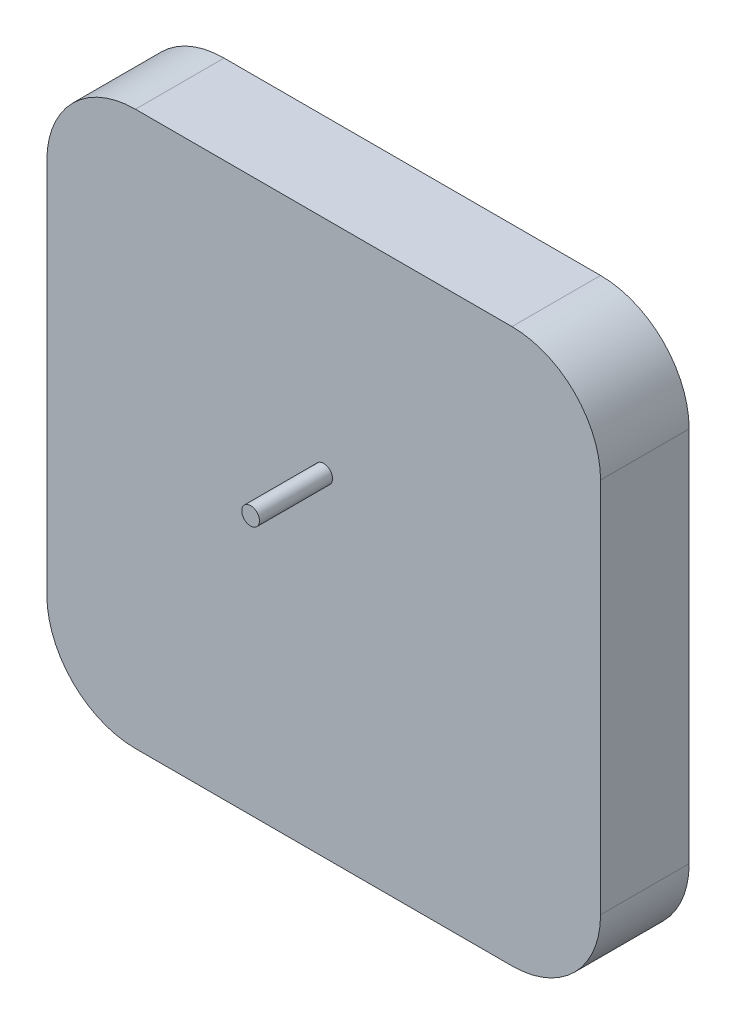
ISO-10303-21;
HEADER;
FILE_DESCRIPTION(('STEP AP214'),'2;1');
FILE_NAME('part.step','',(''),(''),'','','');
FILE_SCHEMA(('AUTOMOTIVE_DESIGN { 1 0 10303 214 1 1 1 1 }'));
ENDSEC;
DATA;
#1=APPLICATION_CONTEXT('core data for automotive mechanical design processes');
#2=APPLICATION_PROTOCOL_DEFINITION('international standard','automotive_design',2000,#1);
#3=PRODUCT_CONTEXT('',#1,'mechanical');
#4=PRODUCT('Part','Part','',(#3));
#5=PRODUCT_RELATED_PRODUCT_CATEGORY('part','',(#4));
#6=PRODUCT_DEFINITION_FORMATION('','',#4);
#7=PRODUCT_DEFINITION_CONTEXT('part definition',#1,'design');
#8=PRODUCT_DEFINITION('design','',#6,#7);
#9=PRODUCT_DEFINITION_SHAPE('','',#8);
#10=(LENGTH_UNIT() NAMED_UNIT(*) SI_UNIT(.MILLI.,.METRE.));
#11=(NAMED_UNIT(*) PLANE_ANGLE_UNIT() SI_UNIT($,.RADIAN.));
#12=(NAMED_UNIT(*) SI_UNIT($,.STERADIAN.) SOLID_ANGLE_UNIT());
#13=UNCERTAINTY_MEASURE_WITH_UNIT(LENGTH_MEASURE(1.E-05),#10,'distance_accuracy_value','');
#14=(GEOMETRIC_REPRESENTATION_CONTEXT(3) GLOBAL_UNCERTAINTY_ASSIGNED_CONTEXT((#13)) GLOBAL_UNIT_ASSIGNED_CONTEXT((#10,
#11,#12)) REPRESENTATION_CONTEXT('',''));
#15=CARTESIAN_POINT('',(0.,0.,0.));
#16=DIRECTION('',(0.,0.,1.));
#17=DIRECTION('',(1.,0.,0.));
#18=AXIS2_PLACEMENT_3D('',#15,#16,#17);
#19=CARTESIAN_POINT('',(8.5,-8.5,4.));
#20=DIRECTION('',(0.,0.,-1.));
#21=DIRECTION('',(-1.,0.,0.));
#22=AXIS2_PLACEMENT_3D('',#19,#20,#21);
#23=CYLINDRICAL_SURFACE('',#22,4.);
#24=CARTESIAN_POINT('',(8.5,-8.5,0.));
#25=DIRECTION('',(0.,0.,1.));
#26=DIRECTION('',(1.,0.,0.));
#27=AXIS2_PLACEMENT_3D('',#24,#25,#26);
#28=CIRCLE('',#27,4.);
#29=CARTESIAN_POINT('',(8.49999999999997,-12.5,0.));
#30=VERTEX_POINT('',#29);
#31=CARTESIAN_POINT('',(12.5,-8.49999999999997,0.));
#32=VERTEX_POINT('',#31);
#33=EDGE_CURVE('E132',#30,#32,#28,.T.);
#34=ORIENTED_EDGE('',*,*,#33,.T.);
#35=DIRECTION('',(0.,0.,-1.));
#36=VECTOR('',#35,1.);
#37=CARTESIAN_POINT('',(12.5,-8.49999999999997,4.));
#38=LINE('',#37,#36);
#39=CARTESIAN_POINT('',(12.5,-8.49999999999997,4.));
#40=VERTEX_POINT('',#39);
#41=EDGE_CURVE('E43',#40,#32,#38,.T.);
#42=ORIENTED_EDGE('',*,*,#41,.F.);
#43=CARTESIAN_POINT('',(8.5,-8.5,4.));
#44=DIRECTION('',(0.,0.,1.));
#45=DIRECTION('',(1.,0.,0.));
#46=AXIS2_PLACEMENT_3D('',#43,#44,#45);
#47=CIRCLE('',#46,4.);
#48=CARTESIAN_POINT('',(8.49999999999997,-12.5,4.));
#49=VERTEX_POINT('',#48);
#50=EDGE_CURVE('E147',#49,#40,#47,.T.);
#51=ORIENTED_EDGE('',*,*,#50,.F.);
#52=DIRECTION('',(0.,0.,-1.));
#53=VECTOR('',#52,1.);
#54=CARTESIAN_POINT('',(8.49999999999997,-12.5,4.));
#55=LINE('',#54,#53);
#56=EDGE_CURVE('E128',#49,#30,#55,.T.);
#57=ORIENTED_EDGE('',*,*,#56,.T.);
#58=EDGE_LOOP('',(#34,#42,#51,#57));
#59=FACE_BOUND('',#58,.T.);
#60=ADVANCED_FACE('F35',(#59),#23,.T.);
#61=CARTESIAN_POINT('',(12.5,8.49999999999998,4.));
#62=DIRECTION('',(-1.,0.,0.));
#63=DIRECTION('',(0.,-1.,0.));
#64=AXIS2_PLACEMENT_3D('',#61,#62,#63);
#65=PLANE('',#64);
#66=DIRECTION('',(0.,1.,0.));
#67=VECTOR('',#66,1.);
#68=CARTESIAN_POINT('',(12.5,8.49999999999998,0.));
#69=LINE('',#68,#67);
#70=CARTESIAN_POINT('',(12.5,8.49999999999998,0.));
#71=VERTEX_POINT('',#70);
#72=EDGE_CURVE('E135',#32,#71,#69,.T.);
#73=ORIENTED_EDGE('',*,*,#72,.T.);
#74=DIRECTION('',(0.,0.,-1.));
#75=VECTOR('',#74,1.);
#76=CARTESIAN_POINT('',(12.5,8.49999999999998,4.));
#77=LINE('',#76,#75);
#78=CARTESIAN_POINT('',(12.5,8.49999999999998,4.));
#79=VERTEX_POINT('',#78);
#80=EDGE_CURVE('E157',#79,#71,#77,.T.);
#81=ORIENTED_EDGE('',*,*,#80,.F.);
#82=DIRECTION('',(0.,1.,0.));
#83=VECTOR('',#82,1.);
#84=CARTESIAN_POINT('',(12.5,8.49999999999998,4.));
#85=LINE('',#84,#83);
#86=EDGE_CURVE('E95',#40,#79,#85,.T.);
#87=ORIENTED_EDGE('',*,*,#86,.F.);
#88=ORIENTED_EDGE('',*,*,#41,.T.);
#89=EDGE_LOOP('',(#73,#81,#87,#88));
#90=FACE_BOUND('',#89,.T.);
#91=ADVANCED_FACE('F160',(#90),#65,.F.);
#92=CARTESIAN_POINT('',(8.5,8.5,4.));
#93=DIRECTION('',(0.,0.,-1.));
#94=DIRECTION('',(-1.,0.,0.));
#95=AXIS2_PLACEMENT_3D('',#92,#93,#94);
#96=CYLINDRICAL_SURFACE('',#95,4.);
#97=CARTESIAN_POINT('',(8.5,8.5,0.));
#98=DIRECTION('',(0.,0.,1.));
#99=DIRECTION('',(-1.,0.,0.));
#100=AXIS2_PLACEMENT_3D('',#97,#98,#99);
#101=CIRCLE('',#100,4.);
#102=CARTESIAN_POINT('',(8.49999999999997,12.5,0.));
#103=VERTEX_POINT('',#102);
#104=EDGE_CURVE('E138',#71,#103,#101,.T.);
#105=ORIENTED_EDGE('',*,*,#104,.T.);
#106=DIRECTION('',(0.,0.,-1.));
#107=VECTOR('',#106,1.);
#108=CARTESIAN_POINT('',(8.49999999999997,12.5,4.));
#109=LINE('',#108,#107);
#110=CARTESIAN_POINT('',(8.49999999999997,12.5,4.));
#111=VERTEX_POINT('',#110);
#112=EDGE_CURVE('E154',#111,#103,#109,.T.);
#113=ORIENTED_EDGE('',*,*,#112,.F.);
#114=CARTESIAN_POINT('',(8.5,8.5,4.));
#115=DIRECTION('',(0.,0.,1.));
#116=DIRECTION('',(-1.,0.,0.));
#117=AXIS2_PLACEMENT_3D('',#114,#115,#116);
#118=CIRCLE('',#117,4.);
#119=EDGE_CURVE('E178',#79,#111,#118,.T.);
#120=ORIENTED_EDGE('',*,*,#119,.F.);
#121=ORIENTED_EDGE('',*,*,#80,.T.);
#122=EDGE_LOOP('',(#105,#113,#120,#121));
#123=FACE_BOUND('',#122,.T.);
#124=ADVANCED_FACE('F171',(#123),#96,.T.);
#125=CARTESIAN_POINT('',(-8.49999999999998,12.5,4.));
#126=DIRECTION('',(0.,-1.,0.));
#127=DIRECTION('',(0.,0.,-1.));
#128=AXIS2_PLACEMENT_3D('',#125,#126,#127);
#129=PLANE('',#128);
#130=DIRECTION('',(-1.,0.,0.));
#131=VECTOR('',#130,1.);
#132=CARTESIAN_POINT('',(-8.49999999999998,12.5,0.));
#133=LINE('',#132,#131);
#134=CARTESIAN_POINT('',(-8.49999999999998,12.5,0.));
#135=VERTEX_POINT('',#134);
#136=EDGE_CURVE('E140',#103,#135,#133,.T.);
#137=ORIENTED_EDGE('',*,*,#136,.T.);
#138=DIRECTION('',(0.,0.,-1.));
#139=VECTOR('',#138,1.);
#140=CARTESIAN_POINT('',(-8.49999999999998,12.5,4.));
#141=LINE('',#140,#139);
#142=CARTESIAN_POINT('',(-8.49999999999998,12.5,4.));
#143=VERTEX_POINT('',#142);
#144=EDGE_CURVE('E151',#143,#135,#141,.T.);
#145=ORIENTED_EDGE('',*,*,#144,.F.);
#146=DIRECTION('',(-1.,0.,0.));
#147=VECTOR('',#146,1.);
#148=CARTESIAN_POINT('',(-8.49999999999998,12.5,4.));
#149=LINE('',#148,#147);
#150=EDGE_CURVE('E177',#111,#143,#149,.T.);
#151=ORIENTED_EDGE('',*,*,#150,.F.);
#152=ORIENTED_EDGE('',*,*,#112,.T.);
#153=EDGE_LOOP('',(#137,#145,#151,#152));
#154=FACE_BOUND('',#153,.T.);
#155=ADVANCED_FACE('F175',(#154),#129,.F.);
#156=CARTESIAN_POINT('',(-8.5,8.5,4.));
#157=DIRECTION('',(0.,0.,-1.));
#158=DIRECTION('',(-1.,0.,0.));
#159=AXIS2_PLACEMENT_3D('',#156,#157,#158);
#160=CYLINDRICAL_SURFACE('',#159,4.);
#161=CARTESIAN_POINT('',(-8.5,8.5,0.));
#162=DIRECTION('',(0.,0.,1.));
#163=DIRECTION('',(1.,0.,0.));
#164=AXIS2_PLACEMENT_3D('',#161,#162,#163);
#165=CIRCLE('',#164,4.);
#166=CARTESIAN_POINT('',(-12.5,8.49999999999997,0.));
#167=VERTEX_POINT('',#166);
#168=EDGE_CURVE('E142',#135,#167,#165,.T.);
#169=ORIENTED_EDGE('',*,*,#168,.T.);
#170=DIRECTION('',(0.,0.,-1.));
#171=VECTOR('',#170,1.);
#172=CARTESIAN_POINT('',(-12.5,8.49999999999997,4.));
#173=LINE('',#172,#171);
#174=CARTESIAN_POINT('',(-12.5,8.49999999999997,4.));
#175=VERTEX_POINT('',#174);
#176=EDGE_CURVE('E123',#175,#167,#173,.T.);
#177=ORIENTED_EDGE('',*,*,#176,.F.);
#178=CARTESIAN_POINT('',(-8.5,8.5,4.));
#179=DIRECTION('',(0.,0.,1.));
#180=DIRECTION('',(1.,0.,0.));
#181=AXIS2_PLACEMENT_3D('',#178,#179,#180);
#182=CIRCLE('',#181,4.);
#183=EDGE_CURVE('E114',#143,#175,#182,.T.);
#184=ORIENTED_EDGE('',*,*,#183,.F.);
#185=ORIENTED_EDGE('',*,*,#144,.T.);
#186=EDGE_LOOP('',(#169,#177,#184,#185));
#187=FACE_BOUND('',#186,.T.);
#188=ADVANCED_FACE('F226',(#187),#160,.T.);
#189=CARTESIAN_POINT('',(-12.5,8.49999999999997,4.));
#190=DIRECTION('',(1.,0.,0.));
#191=DIRECTION('',(0.,1.,0.));
#192=AXIS2_PLACEMENT_3D('',#189,#190,#191);
#193=PLANE('',#192);
#194=DIRECTION('',(0.,-1.,0.));
#195=VECTOR('',#194,1.);
#196=CARTESIAN_POINT('',(-12.5,8.49999999999997,0.));
#197=LINE('',#196,#195);
#198=CARTESIAN_POINT('',(-12.5,-8.49999999999997,0.));
#199=VERTEX_POINT('',#198);
#200=EDGE_CURVE('E122',#167,#199,#197,.T.);
#201=ORIENTED_EDGE('',*,*,#200,.T.);
#202=DIRECTION('',(0.,0.,-1.));
#203=VECTOR('',#202,1.);
#204=CARTESIAN_POINT('',(-12.5,-8.49999999999997,4.));
#205=LINE('',#204,#203);
#206=CARTESIAN_POINT('',(-12.5,-8.49999999999997,4.));
#207=VERTEX_POINT('',#206);
#208=EDGE_CURVE('E119',#207,#199,#205,.T.);
#209=ORIENTED_EDGE('',*,*,#208,.F.);
#210=DIRECTION('',(0.,-1.,0.));
#211=VECTOR('',#210,1.);
#212=CARTESIAN_POINT('',(-12.5,8.49999999999997,4.));
#213=LINE('',#212,#211);
#214=EDGE_CURVE('E108',#175,#207,#213,.T.);
#215=ORIENTED_EDGE('',*,*,#214,.F.);
#216=ORIENTED_EDGE('',*,*,#176,.T.);
#217=EDGE_LOOP('',(#201,#209,#215,#216));
#218=FACE_BOUND('',#217,.T.);
#219=ADVANCED_FACE('F120',(#218),#193,.F.);
#220=CARTESIAN_POINT('',(-8.5,-8.5,4.));
#221=DIRECTION('',(0.,0.,-1.));
#222=DIRECTION('',(-1.,0.,0.));
#223=AXIS2_PLACEMENT_3D('',#220,#221,#222);
#224=CYLINDRICAL_SURFACE('',#223,4.);
#225=CARTESIAN_POINT('',(-8.5,-8.5,0.));
#226=DIRECTION('',(0.,0.,1.));
#227=DIRECTION('',(1.,0.,0.));
#228=AXIS2_PLACEMENT_3D('',#225,#226,#227);
#229=CIRCLE('',#228,4.);
#230=CARTESIAN_POINT('',(-8.49999999999997,-12.5,0.));
#231=VERTEX_POINT('',#230);
#232=EDGE_CURVE('E80',#199,#231,#229,.T.);
#233=ORIENTED_EDGE('',*,*,#232,.T.);
#234=DIRECTION('',(0.,0.,-1.));
#235=VECTOR('',#234,1.);
#236=CARTESIAN_POINT('',(-8.49999999999997,-12.5,4.));
#237=LINE('',#236,#235);
#238=CARTESIAN_POINT('',(-8.49999999999997,-12.5,4.));
#239=VERTEX_POINT('',#238);
#240=EDGE_CURVE('E124',#239,#231,#237,.T.);
#241=ORIENTED_EDGE('',*,*,#240,.F.);
#242=CARTESIAN_POINT('',(-8.5,-8.5,4.));
#243=DIRECTION('',(0.,0.,1.));
#244=DIRECTION('',(1.,0.,0.));
#245=AXIS2_PLACEMENT_3D('',#242,#243,#244);
#246=CIRCLE('',#245,4.);
#247=EDGE_CURVE('E112',#207,#239,#246,.T.);
#248=ORIENTED_EDGE('',*,*,#247,.F.);
#249=ORIENTED_EDGE('',*,*,#208,.T.);
#250=EDGE_LOOP('',(#233,#241,#248,#249));
#251=FACE_BOUND('',#250,.T.);
#252=ADVANCED_FACE('F126',(#251),#224,.T.);
#253=CARTESIAN_POINT('',(-8.49999999999997,-12.5,4.));
#254=DIRECTION('',(0.,1.,0.));
#255=DIRECTION('',(0.,0.,1.));
#256=AXIS2_PLACEMENT_3D('',#253,#254,#255);
#257=PLANE('',#256);
#258=DIRECTION('',(1.,0.,0.));
#259=VECTOR('',#258,1.);
#260=CARTESIAN_POINT('',(-8.49999999999997,-12.5,0.));
#261=LINE('',#260,#259);
#262=EDGE_CURVE('E86',#231,#30,#261,.T.);
#263=ORIENTED_EDGE('',*,*,#262,.T.);
#264=ORIENTED_EDGE('',*,*,#56,.F.);
#265=DIRECTION('',(1.,0.,0.));
#266=VECTOR('',#265,1.);
#267=CARTESIAN_POINT('',(-8.49999999999997,-12.5,4.));
#268=LINE('',#267,#266);
#269=EDGE_CURVE('E51',#239,#49,#268,.T.);
#270=ORIENTED_EDGE('',*,*,#269,.F.);
#271=ORIENTED_EDGE('',*,*,#240,.T.);
#272=EDGE_LOOP('',(#263,#264,#270,#271));
#273=FACE_BOUND('',#272,.T.);
#274=ADVANCED_FACE('F211',(#273),#257,.F.);
#275=CARTESIAN_POINT('',(8.5,-8.5,4.));
#276=DIRECTION('',(0.,0.,1.));
#277=DIRECTION('',(1.,0.,0.));
#278=AXIS2_PLACEMENT_3D('',#275,#276,#277);
#279=PLANE('',#278);
#280=CARTESIAN_POINT('',(0.,2.5,4.));
#281=DIRECTION('',(0.,0.,1.));
#282=DIRECTION('',(1.,0.,0.));
#283=AXIS2_PLACEMENT_3D('',#280,#281,#282);
#284=CIRCLE('',#283,0.4);
#285=CARTESIAN_POINT('',(0.4,2.5,4.));
#286=VERTEX_POINT('',#285);
#287=EDGE_CURVE('E184',#286,#286,#284,.T.);
#288=ORIENTED_EDGE('',*,*,#287,.F.);
#289=EDGE_LOOP('',(#288));
#290=FACE_BOUND('',#289,.T.);
#291=ORIENTED_EDGE('',*,*,#50,.T.);
#292=ORIENTED_EDGE('',*,*,#86,.T.);
#293=ORIENTED_EDGE('',*,*,#119,.T.);
#294=ORIENTED_EDGE('',*,*,#150,.T.);
#295=ORIENTED_EDGE('',*,*,#183,.T.);
#296=ORIENTED_EDGE('',*,*,#214,.T.);
#297=ORIENTED_EDGE('',*,*,#247,.T.);
#298=ORIENTED_EDGE('',*,*,#269,.T.);
#299=EDGE_LOOP('',(#291,#292,#293,#294,#295,#296,#297,#298));
#300=FACE_BOUND('',#299,.T.);
#301=ADVANCED_FACE('F110',(#290,#300),#279,.T.);
#302=CARTESIAN_POINT('',(8.5,-8.5,0.));
#303=DIRECTION('',(0.,0.,1.));
#304=DIRECTION('',(1.,0.,0.));
#305=AXIS2_PLACEMENT_3D('',#302,#303,#304);
#306=PLANE('',#305);
#307=CARTESIAN_POINT('',(0.,2.5,0.));
#308=DIRECTION('',(0.,0.,1.));
#309=DIRECTION('',(1.,0.,0.));
#310=AXIS2_PLACEMENT_3D('',#307,#308,#309);
#311=CIRCLE('',#310,1.5);
#312=CARTESIAN_POINT('',(1.5,2.5,0.));
#313=VERTEX_POINT('',#312);
#314=EDGE_CURVE('E11',#313,#313,#311,.F.);
#315=ORIENTED_EDGE('',*,*,#314,.F.);
#316=EDGE_LOOP('',(#315));
#317=FACE_BOUND('',#316,.T.);
#318=ORIENTED_EDGE('',*,*,#33,.F.);
#319=ORIENTED_EDGE('',*,*,#262,.F.);
#320=ORIENTED_EDGE('',*,*,#232,.F.);
#321=ORIENTED_EDGE('',*,*,#200,.F.);
#322=ORIENTED_EDGE('',*,*,#168,.F.);
#323=ORIENTED_EDGE('',*,*,#136,.F.);
#324=ORIENTED_EDGE('',*,*,#104,.F.);
#325=ORIENTED_EDGE('',*,*,#72,.F.);
#326=EDGE_LOOP('',(#318,#319,#320,#321,#322,#323,#324,#325));
#327=FACE_BOUND('',#326,.T.);
#328=ADVANCED_FACE('F165',(#317,#327),#306,.F.);
#329=CARTESIAN_POINT('',(0.,2.5,7.3));
#330=DIRECTION('',(0.,0.,-1.));
#331=DIRECTION('',(-1.,0.,0.));
#332=AXIS2_PLACEMENT_3D('',#329,#330,#331);
#333=CYLINDRICAL_SURFACE('',#332,0.4);
#334=CARTESIAN_POINT('',(0.,2.5,7.3));
#335=DIRECTION('',(0.,0.,1.));
#336=DIRECTION('',(1.,0.,0.));
#337=AXIS2_PLACEMENT_3D('',#334,#335,#336);
#338=CIRCLE('',#337,0.4);
#339=CARTESIAN_POINT('',(0.4,2.5,7.3));
#340=VERTEX_POINT('',#339);
#341=EDGE_CURVE('E136',#340,#340,#338,.T.);
#342=ORIENTED_EDGE('',*,*,#341,.F.);
#343=EDGE_LOOP('',(#342));
#344=FACE_BOUND('',#343,.T.);
#345=ORIENTED_EDGE('',*,*,#287,.T.);
#346=EDGE_LOOP('',(#345));
#347=FACE_BOUND('',#346,.T.);
#348=ADVANCED_FACE('F203',(#344,#347),#333,.T.);
#349=CARTESIAN_POINT('',(0.,2.5,7.3));
#350=DIRECTION('',(0.,0.,1.));
#351=DIRECTION('',(1.,0.,0.));
#352=AXIS2_PLACEMENT_3D('',#349,#350,#351);
#353=PLANE('',#352);
#354=ORIENTED_EDGE('',*,*,#341,.T.);
#355=EDGE_LOOP('',(#354));
#356=FACE_BOUND('',#355,.T.);
#357=ADVANCED_FACE('F198',(#356),#353,.T.);
#358=CARTESIAN_POINT('',(0.,2.5,-0.7));
#359=DIRECTION('',(0.,0.,1.));
#360=DIRECTION('',(1.,0.,0.));
#361=AXIS2_PLACEMENT_3D('',#358,#359,#360);
#362=CYLINDRICAL_SURFACE('',#361,1.5);
#363=CARTESIAN_POINT('',(0.,2.5,-0.7));
#364=DIRECTION('',(0.,0.,-1.));
#365=DIRECTION('',(-1.,0.,0.));
#366=AXIS2_PLACEMENT_3D('',#363,#364,#365);
#367=CIRCLE('',#366,1.5);
#368=CARTESIAN_POINT('',(-1.5,2.5,-0.7));
#369=VERTEX_POINT('',#368);
#370=EDGE_CURVE('E187',#369,#369,#367,.T.);
#371=ORIENTED_EDGE('',*,*,#370,.F.);
#372=EDGE_LOOP('',(#371));
#373=FACE_BOUND('',#372,.T.);
#374=ORIENTED_EDGE('',*,*,#314,.T.);
#375=EDGE_LOOP('',(#374));
#376=FACE_BOUND('',#375,.T.);
#377=ADVANCED_FACE('F195',(#373,#376),#362,.T.);
#378=CARTESIAN_POINT('',(0.,2.5,-0.7));
#379=DIRECTION('',(0.,0.,-1.));
#380=DIRECTION('',(-1.,0.,0.));
#381=AXIS2_PLACEMENT_3D('',#378,#379,#380);
#382=PLANE('',#381);
#383=ORIENTED_EDGE('',*,*,#370,.T.);
#384=EDGE_LOOP('',(#383));
#385=FACE_BOUND('',#384,.T.);
#386=ADVANCED_FACE('F193',(#385),#382,.T.);
#387=CLOSED_SHELL('',(#60,#91,#124,#155,#188,#219,#252,#274,#301,#328,#348,#357,#377,#386));
#388=MANIFOLD_SOLID_BREP('B2',#387);
#389=ADVANCED_BREP_SHAPE_REPRESENTATION('',(#18,#388),#14);
#390=SHAPE_DEFINITION_REPRESENTATION(#9,#389);
ENDSEC;
END-ISO-10303-21;
